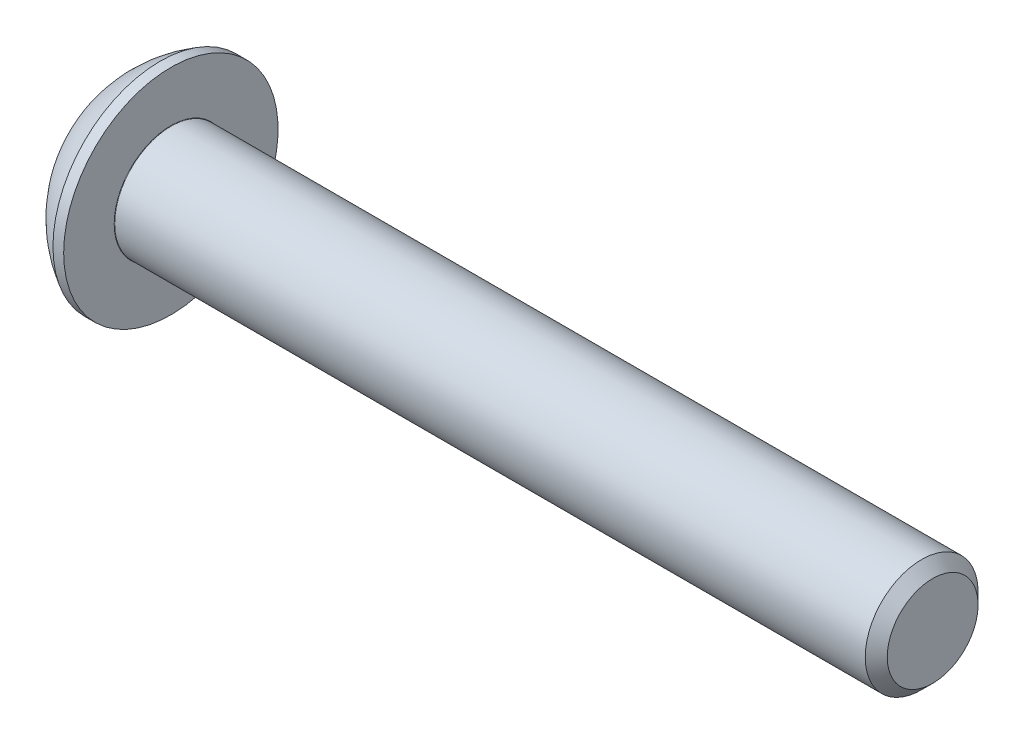
ISO-10303-21;
HEADER;
FILE_DESCRIPTION(('STEP AP214'),'2;1');
FILE_NAME('part.step','',(''),(''),'','','');
FILE_SCHEMA(('AUTOMOTIVE_DESIGN { 1 0 10303 214 1 1 1 1 }'));
ENDSEC;
DATA;
#1=APPLICATION_CONTEXT('core data for automotive mechanical design processes');
#2=APPLICATION_PROTOCOL_DEFINITION('international standard','automotive_design',2000,#1);
#3=PRODUCT_CONTEXT('',#1,'mechanical');
#4=PRODUCT('Part','Part','',(#3));
#5=PRODUCT_RELATED_PRODUCT_CATEGORY('part','',(#4));
#6=PRODUCT_DEFINITION_FORMATION('','',#4);
#7=PRODUCT_DEFINITION_CONTEXT('part definition',#1,'design');
#8=PRODUCT_DEFINITION('design','',#6,#7);
#9=PRODUCT_DEFINITION_SHAPE('','',#8);
#10=(LENGTH_UNIT() NAMED_UNIT(*) SI_UNIT(.MILLI.,.METRE.));
#11=(NAMED_UNIT(*) PLANE_ANGLE_UNIT() SI_UNIT($,.RADIAN.));
#12=(NAMED_UNIT(*) SI_UNIT($,.STERADIAN.) SOLID_ANGLE_UNIT());
#13=UNCERTAINTY_MEASURE_WITH_UNIT(LENGTH_MEASURE(1.E-05),#10,'distance_accuracy_value','');
#14=(GEOMETRIC_REPRESENTATION_CONTEXT(3) GLOBAL_UNCERTAINTY_ASSIGNED_CONTEXT((#13)) GLOBAL_UNIT_ASSIGNED_CONTEXT((#10,
#11,#12)) REPRESENTATION_CONTEXT('',''));
#15=CARTESIAN_POINT('',(0.,0.,0.));
#16=DIRECTION('',(0.,0.,1.));
#17=DIRECTION('',(1.,0.,0.));
#18=AXIS2_PLACEMENT_3D('',#15,#16,#17);
#19=CARTESIAN_POINT('',(0.,0.,0.));
#20=DIRECTION('',(-1.,0.,0.));
#21=DIRECTION('',(0.,0.,1.));
#22=AXIS2_PLACEMENT_3D('',#19,#20,#21);
#23=PLANE('',#22);
#24=CARTESIAN_POINT('',(0.,0.,0.));
#25=DIRECTION('',(-1.,0.,0.));
#26=DIRECTION('',(0.,0.,1.));
#27=AXIS2_PLACEMENT_3D('',#24,#25,#26);
#28=CIRCLE('',#27,1.9);
#29=CARTESIAN_POINT('',(0.,1.9,0.));
#30=VERTEX_POINT('',#29);
#31=EDGE_CURVE('E158',#30,#30,#28,.T.);
#32=ORIENTED_EDGE('',*,*,#31,.T.);
#33=EDGE_LOOP('',(#32));
#34=FACE_BOUND('',#33,.T.);
#35=DIRECTION('',(0.,-1.,0.));
#36=VECTOR('',#35,1.);
#37=CARTESIAN_POINT('',(0.,-0.721687836487031,1.25));
#38=LINE('',#37,#36);
#39=CARTESIAN_POINT('',(0.,0.721687836487033,1.25));
#40=VERTEX_POINT('',#39);
#41=CARTESIAN_POINT('',(0.,-0.721687836487031,1.25));
#42=VERTEX_POINT('',#41);
#43=EDGE_CURVE('E53',#40,#42,#38,.T.);
#44=ORIENTED_EDGE('',*,*,#43,.T.);
#45=DIRECTION('',(0.,-0.5,-0.866025403784438));
#46=VECTOR('',#45,1.);
#47=CARTESIAN_POINT('',(0.,-1.44337567297406,0.));
#48=LINE('',#47,#46);
#49=CARTESIAN_POINT('',(0.,-1.44337567297406,0.));
#50=VERTEX_POINT('',#49);
#51=EDGE_CURVE('E278',#42,#50,#48,.T.);
#52=ORIENTED_EDGE('',*,*,#51,.T.);
#53=DIRECTION('',(0.,0.5,-0.866025403784439));
#54=VECTOR('',#53,1.);
#55=CARTESIAN_POINT('',(0.,-0.721687836487031,-1.25));
#56=LINE('',#55,#54);
#57=CARTESIAN_POINT('',(0.,-0.721687836487031,-1.25));
#58=VERTEX_POINT('',#57);
#59=EDGE_CURVE('E133',#50,#58,#56,.T.);
#60=ORIENTED_EDGE('',*,*,#59,.T.);
#61=DIRECTION('',(0.,1.,0.));
#62=VECTOR('',#61,1.);
#63=CARTESIAN_POINT('',(0.,0.721687836487033,-1.25));
#64=LINE('',#63,#62);
#65=CARTESIAN_POINT('',(0.,0.721687836487033,-1.25));
#66=VERTEX_POINT('',#65);
#67=EDGE_CURVE('E281',#58,#66,#64,.T.);
#68=ORIENTED_EDGE('',*,*,#67,.T.);
#69=DIRECTION('',(0.,0.5,0.866025403784439));
#70=VECTOR('',#69,1.);
#71=CARTESIAN_POINT('',(0.,1.44337567297406,0.));
#72=LINE('',#71,#70);
#73=CARTESIAN_POINT('',(0.,1.44337567297406,0.));
#74=VERTEX_POINT('',#73);
#75=EDGE_CURVE('E283',#66,#74,#72,.T.);
#76=ORIENTED_EDGE('',*,*,#75,.T.);
#77=DIRECTION('',(0.,-0.5,0.866025403784439));
#78=VECTOR('',#77,1.);
#79=CARTESIAN_POINT('',(0.,0.721687836487033,1.25));
#80=LINE('',#79,#78);
#81=EDGE_CURVE('E285',#74,#40,#80,.T.);
#82=ORIENTED_EDGE('',*,*,#81,.T.);
#83=EDGE_LOOP('',(#44,#52,#60,#68,#76,#82));
#84=FACE_BOUND('',#83,.T.);
#85=ADVANCED_FACE('F38',(#34,#84),#23,.T.);
#86=CARTESIAN_POINT('',(3.88527472527473,0.,0.));
#87=DIRECTION('',(-1.,0.,0.));
#88=DIRECTION('',(0.,1.,0.));
#89=AXIS2_PLACEMENT_3D('',#86,#87,#88);
#90=SPHERICAL_SURFACE('',#89,4.32496932831421);
#91=CARTESIAN_POINT('',(1.82,0.,0.));
#92=DIRECTION('',(-1.,0.,0.));
#93=DIRECTION('',(0.,0.,1.));
#94=AXIS2_PLACEMENT_3D('',#91,#92,#93);
#95=CIRCLE('',#94,3.8);
#96=CARTESIAN_POINT('',(1.82,3.8,0.));
#97=VERTEX_POINT('',#96);
#98=EDGE_CURVE('E155',#97,#97,#95,.T.);
#99=CARTESIAN_POINT('',(1.82,3.8,0.));
#100=CARTESIAN_POINT('',(1.79553223778235,3.78670197498787,0.));
#101=CARTESIAN_POINT('',(1.77119294730718,3.77316757105695,0.));
#102=CARTESIAN_POINT('',(1.72278031308152,3.74563119292022,0.));
#103=CARTESIAN_POINT('',(1.69870696933103,3.73162921871441,0.));
#104=CARTESIAN_POINT('',(1.65083523179446,3.7031628875906,0.));
#105=CARTESIAN_POINT('',(1.62703683800837,3.6886985306726,0.));
#106=CARTESIAN_POINT('',(1.57972387446203,3.65931284095831,0.));
#107=CARTESIAN_POINT('',(1.55620930470177,3.64439150816201,0.));
#108=CARTESIAN_POINT('',(1.50947276449225,3.61409743150663,0.));
#109=CARTESIAN_POINT('',(1.48625079404298,3.59872468764754,0.));
#110=CARTESIAN_POINT('',(1.44010811665664,3.56753352546924,0.));
#111=CARTESIAN_POINT('',(1.41718740971957,3.55171510715004,0.));
#112=CARTESIAN_POINT('',(1.37165581166264,3.51963849804541,0.));
#113=CARTESIAN_POINT('',(1.34904492054277,3.50338030725998,0.));
#114=CARTESIAN_POINT('',(1.30414139068938,3.47043021954608,0.));
#115=CARTESIAN_POINT('',(1.28184875195586,3.45373832261761,0.));
#116=CARTESIAN_POINT('',(1.23759004473439,3.41992705070111,0.));
#117=CARTESIAN_POINT('',(1.21562397624644,3.40280767571308,0.));
#118=CARTESIAN_POINT('',(1.17202660551528,3.3681478352793,0.));
#119=CARTESIAN_POINT('',(1.15039530327208,3.35060736983354,0.));
#120=CARTESIAN_POINT('',(1.10747553612391,3.31511189319918,0.));
#121=CARTESIAN_POINT('',(1.08618707121895,3.29715688201057,0.));
#122=CARTESIAN_POINT('',(1.04396092192025,3.26083901328234,0.));
#123=CARTESIAN_POINT('',(1.02302323752652,3.24247615574272,0.));
#124=CARTESIAN_POINT('',(0.981506461539866,3.20534944588,0.));
#125=CARTESIAN_POINT('',(0.960927369946953,3.18658559355691,0.));
#126=CARTESIAN_POINT('',(0.920135458053,3.14866389531445,0.));
#127=CARTESIAN_POINT('',(0.899922637751959,3.12950604939509,0.));
#128=CARTESIAN_POINT('',(0.859870810269304,3.09080351215454,0.));
#129=CARTESIAN_POINT('',(0.84003180308769,3.07125882083336,0.));
#130=CARTESIAN_POINT('',(0.800735004193914,3.0317898853238,0.));
#131=CARTESIAN_POINT('',(0.781277212481753,3.01186564113541,0.));
#132=CARTESIAN_POINT('',(0.74275010463742,2.97164503404517,0.));
#133=CARTESIAN_POINT('',(0.723680788505248,2.95134867114332,0.));
#134=CARTESIAN_POINT('',(0.685937746983035,2.91039139962521,0.));
#135=CARTESIAN_POINT('',(0.667264021592993,2.88973049100894,0.));
#136=CARTESIAN_POINT('',(0.630319129113973,2.84805183708071,0.));
#137=CARTESIAN_POINT('',(0.612047962024995,2.82703409176873,0.));
#138=CARTESIAN_POINT('',(0.575915003504076,2.78464960661105,0.));
#139=CARTESIAN_POINT('',(0.558053212072136,2.76328286676534,0.));
#140=CARTESIAN_POINT('',(0.522745669474639,2.72020836491933,0.));
#141=CARTESIAN_POINT('',(0.505299918309083,2.69850060291903,0.));
#142=CARTESIAN_POINT('',(0.470830965620255,2.65475215638556,0.));
#143=CARTESIAN_POINT('',(0.453807764096983,2.63271147185239,0.));
#144=CARTESIAN_POINT('',(0.420190262406822,2.58830540409509,0.));
#145=CARTESIAN_POINT('',(0.403595962239933,2.56594002087097,0.));
#146=CARTESIAN_POINT('',(0.370842454943267,2.52089290072626,0.));
#147=CARTESIAN_POINT('',(0.354683247813489,2.49821116380567,0.));
#148=CARTESIAN_POINT('',(0.322805955934172,2.45253979929826,0.));
#149=CARTESIAN_POINT('',(0.307087871184632,2.42955017171145,0.));
#150=CARTESIAN_POINT('',(0.276098688799191,2.38327160379141,0.));
#151=CARTESIAN_POINT('',(0.26082759116329,2.35998266345818,0.));
#152=CARTESIAN_POINT('',(0.230738081024336,2.31311415961106,0.));
#153=CARTESIAN_POINT('',(0.215919668521284,2.28953459609717,0.));
#154=CARTESIAN_POINT('',(0.186741057514276,2.24209364401868,0.));
#155=CARTESIAN_POINT('',(0.172380859010322,2.21823225545407,0.));
#156=CARTESIAN_POINT('',(0.144124034818959,2.17023655608655,0.));
#157=CARTESIAN_POINT('',(0.13022740913155,2.14610224528364,0.));
#158=CARTESIAN_POINT('',(0.102902912986767,2.09756970784785,0.));
#159=CARTESIAN_POINT('',(0.0894750425293926,2.07317148121498,0.));
#160=CARTESIAN_POINT('',(0.0630930771761374,2.02412021042083,0.));
#161=CARTESIAN_POINT('',(0.0501389822802571,1.99946716625955,0.));
#162=CARTESIAN_POINT('',(0.0247093637594993,1.94991547834234,0.));
#163=CARTESIAN_POINT('',(0.012233840134622,1.9250168345864,0.));
#164=CARTESIAN_POINT('',(0.,1.9,0.));
#165=B_SPLINE_CURVE_WITH_KNOTS('',3,(#99,#100,#101,#102,#103,#104,#105,#106,#107,#108,#109,#110,
#111,#112,#113,#114,#115,#116,#117,#118,#119,#120,#121,#122,#123,#124,#125,#126,#127,#128,#129,
#130,#131,#132,#133,#134,#135,#136,#137,#138,#139,#140,#141,#142,#143,#144,#145,#146,#147,#148,
#149,#150,#151,#152,#153,#154,#155,#156,#157,#158,#159,#160,#161,#162,#163,#164),.UNSPECIFIED.,
.F.,.F.,(4,2,2,2,2,2,2,2,2,2,2,2,2,2,2,2,2,2,2,2,2,2,2,2,2,2,2,2,2,2,2,2,4),(0.,
0.083542578086179,0.167085156172358,0.250627734258537,0.334170312344716,0.417712890430896,
0.501255468517075,0.584798046603255,0.668340624689433,0.751883202775613,0.835425780861792,
0.91896835894797,1.00251093703415,1.08605351512033,1.16959609320651,1.25313867129269,
1.33668124937887,1.42022382746505,1.50376640555123,1.5873089836374,1.67085156172358,
1.75439413980976,1.83793671789594,1.92147929598212,2.0050218740683,2.08856445215448,
2.17210703024066,2.25564960832684,2.33919218641302,2.4227347644992,2.50627734258538,
2.58981992067155,2.67336249875773),.UNSPECIFIED.);
#166=EDGE_CURVE('BSEAM179',#97,#30,#165,.T.);
#167=ORIENTED_EDGE('',*,*,#98,.T.);
#168=ORIENTED_EDGE('',*,*,#31,.F.);
#169=ORIENTED_EDGE('',*,*,#166,.T.);
#170=ORIENTED_EDGE('',*,*,#166,.F.);
#171=EDGE_LOOP('',(#167,#169,#168,#170));
#172=FACE_BOUND('',#171,.T.);
#173=ADVANCED_FACE('F179',(#172),#90,.T.);
#174=CARTESIAN_POINT('',(0.,0.,0.));
#175=DIRECTION('',(-1.,0.,0.));
#176=DIRECTION('',(0.,0.,1.));
#177=AXIS2_PLACEMENT_3D('',#174,#175,#176);
#178=CYLINDRICAL_SURFACE('',#177,3.8);
#179=ORIENTED_EDGE('',*,*,#98,.F.);
#180=EDGE_LOOP('',(#179));
#181=FACE_BOUND('',#180,.T.);
#182=CARTESIAN_POINT('',(2.2,0.,0.));
#183=DIRECTION('',(-1.,0.,0.));
#184=DIRECTION('',(0.,0.,1.));
#185=AXIS2_PLACEMENT_3D('',#182,#183,#184);
#186=CIRCLE('',#185,3.8);
#187=CARTESIAN_POINT('',(2.2,0.,3.8));
#188=VERTEX_POINT('',#187);
#189=EDGE_CURVE('E152',#188,#188,#186,.T.);
#190=ORIENTED_EDGE('',*,*,#189,.T.);
#191=EDGE_LOOP('',(#190));
#192=FACE_BOUND('',#191,.T.);
#193=ADVANCED_FACE('F184',(#181,#192),#178,.T.);
#194=CARTESIAN_POINT('',(2.2,2.,0.));
#195=DIRECTION('',(-1.,0.,0.));
#196=DIRECTION('',(0.,0.,1.));
#197=AXIS2_PLACEMENT_3D('',#194,#195,#196);
#198=PLANE('',#197);
#199=CARTESIAN_POINT('',(2.2,0.,0.));
#200=DIRECTION('',(-1.,0.,0.));
#201=DIRECTION('',(0.,0.,1.));
#202=AXIS2_PLACEMENT_3D('',#199,#200,#201);
#203=CIRCLE('',#202,2.01);
#204=CARTESIAN_POINT('',(2.2,0.,2.01));
#205=VERTEX_POINT('',#204);
#206=EDGE_CURVE('E46',#205,#205,#203,.T.);
#207=ORIENTED_EDGE('',*,*,#206,.T.);
#208=EDGE_LOOP('',(#207));
#209=FACE_BOUND('',#208,.T.);
#210=ORIENTED_EDGE('',*,*,#189,.F.);
#211=EDGE_LOOP('',(#210));
#212=FACE_BOUND('',#211,.T.);
#213=ADVANCED_FACE('F163',(#209,#212),#198,.F.);
#214=CARTESIAN_POINT('',(0.,0.,0.));
#215=DIRECTION('',(-1.,0.,0.));
#216=DIRECTION('',(0.,0.,1.));
#217=AXIS2_PLACEMENT_3D('',#214,#215,#216);
#218=CYLINDRICAL_SURFACE('',#217,2.);
#219=CARTESIAN_POINT('',(2.21,0.,0.));
#220=DIRECTION('',(-1.,0.,0.));
#221=DIRECTION('',(0.,0.,1.));
#222=AXIS2_PLACEMENT_3D('',#219,#220,#221);
#223=CIRCLE('',#222,2.);
#224=CARTESIAN_POINT('',(2.21,0.,2.));
#225=VERTEX_POINT('',#224);
#226=EDGE_CURVE('E11',#225,#225,#223,.F.);
#227=ORIENTED_EDGE('',*,*,#226,.T.);
#228=EDGE_LOOP('',(#227));
#229=FACE_BOUND('',#228,.T.);
#230=CARTESIAN_POINT('',(28.81,0.,0.));
#231=DIRECTION('',(-1.,0.,0.));
#232=DIRECTION('',(0.,0.,1.));
#233=AXIS2_PLACEMENT_3D('',#230,#231,#232);
#234=CIRCLE('',#233,2.);
#235=CARTESIAN_POINT('',(28.81,0.,2.));
#236=VERTEX_POINT('',#235);
#237=EDGE_CURVE('E149',#236,#236,#234,.T.);
#238=ORIENTED_EDGE('',*,*,#237,.T.);
#239=EDGE_LOOP('',(#238));
#240=FACE_BOUND('',#239,.T.);
#241=ADVANCED_FACE('F193',(#229,#240),#218,.T.);
#242=CARTESIAN_POINT('',(29.2,0.,0.));
#243=DIRECTION('',(-1.,0.,0.));
#244=DIRECTION('',(0.,0.,1.));
#245=AXIS2_PLACEMENT_3D('',#242,#243,#244);
#246=CONICAL_SURFACE('',#245,1.61,0.785398163397443);
#247=ORIENTED_EDGE('',*,*,#237,.F.);
#248=EDGE_LOOP('',(#247));
#249=FACE_BOUND('',#248,.T.);
#250=CARTESIAN_POINT('',(29.2,0.,0.));
#251=DIRECTION('',(-1.,0.,0.));
#252=DIRECTION('',(0.,0.,1.));
#253=AXIS2_PLACEMENT_3D('',#250,#251,#252);
#254=CIRCLE('',#253,1.61);
#255=CARTESIAN_POINT('',(29.2,0.,1.61));
#256=VERTEX_POINT('',#255);
#257=EDGE_CURVE('E145',#256,#256,#254,.T.);
#258=ORIENTED_EDGE('',*,*,#257,.T.);
#259=EDGE_LOOP('',(#258));
#260=FACE_BOUND('',#259,.T.);
#261=ADVANCED_FACE('F174',(#249,#260),#246,.T.);
#262=CARTESIAN_POINT('',(29.2,0.,0.));
#263=DIRECTION('',(-1.,0.,0.));
#264=DIRECTION('',(0.,0.,1.));
#265=AXIS2_PLACEMENT_3D('',#262,#263,#264);
#266=PLANE('',#265);
#267=ORIENTED_EDGE('',*,*,#257,.F.);
#268=EDGE_LOOP('',(#267));
#269=FACE_BOUND('',#268,.T.);
#270=ADVANCED_FACE('F167',(#269),#266,.F.);
#271=CARTESIAN_POINT('',(2.21,0.,0.));
#272=DIRECTION('',(-1.,0.,0.));
#273=DIRECTION('',(0.,0.,1.));
#274=AXIS2_PLACEMENT_3D('',#271,#272,#273);
#275=TOROIDAL_SURFACE('',#274,2.01,0.01);
#276=ORIENTED_EDGE('',*,*,#226,.F.);
#277=EDGE_LOOP('',(#276));
#278=FACE_BOUND('',#277,.T.);
#279=ORIENTED_EDGE('',*,*,#206,.F.);
#280=EDGE_LOOP('',(#279));
#281=FACE_BOUND('',#280,.T.);
#282=ADVANCED_FACE('F40',(#278,#281),#275,.F.);
#283=CARTESIAN_POINT('',(1.3,-1.44337567297406,0.));
#284=DIRECTION('',(0.,0.866025403784438,-0.5));
#285=DIRECTION('',(0.,0.5,0.866025403784439));
#286=AXIS2_PLACEMENT_3D('',#283,#284,#285);
#287=PLANE('',#286);
#288=DIRECTION('',(0.,-0.5,-0.866025403784438));
#289=VECTOR('',#288,1.);
#290=CARTESIAN_POINT('',(1.3,-1.44337567297406,0.));
#291=LINE('',#290,#289);
#292=CARTESIAN_POINT('',(1.3,-0.721687836487031,1.25));
#293=VERTEX_POINT('',#292);
#294=CARTESIAN_POINT('',(1.3,-1.08253175473055,0.625));
#295=VERTEX_POINT('',#294);
#296=EDGE_CURVE('E119',#293,#295,#291,.T.);
#297=ORIENTED_EDGE('',*,*,#296,.T.);
#298=CARTESIAN_POINT('',(1.3,-1.44337567297406,0.));
#299=VERTEX_POINT('',#298);
#300=EDGE_CURVE('E114',#295,#299,#291,.T.);
#301=ORIENTED_EDGE('',*,*,#300,.T.);
#302=DIRECTION('',(-1.,0.,0.));
#303=VECTOR('',#302,1.);
#304=CARTESIAN_POINT('',(1.3,-1.44337567297406,0.));
#305=LINE('',#304,#303);
#306=EDGE_CURVE('E116',#299,#50,#305,.T.);
#307=ORIENTED_EDGE('',*,*,#306,.T.);
#308=ORIENTED_EDGE('',*,*,#51,.F.);
#309=DIRECTION('',(-1.,0.,0.));
#310=VECTOR('',#309,1.);
#311=CARTESIAN_POINT('',(1.3,-0.721687836487031,1.25));
#312=LINE('',#311,#310);
#313=EDGE_CURVE('E274',#293,#42,#312,.T.);
#314=ORIENTED_EDGE('',*,*,#313,.F.);
#315=EDGE_LOOP('',(#297,#301,#307,#308,#314));
#316=FACE_BOUND('',#315,.T.);
#317=ADVANCED_FACE('F115',(#316),#287,.T.);
#318=CARTESIAN_POINT('',(1.3,-0.721687836487031,-1.25));
#319=DIRECTION('',(0.,0.866025403784439,0.5));
#320=DIRECTION('',(0.,-0.5,0.866025403784439));
#321=AXIS2_PLACEMENT_3D('',#318,#319,#320);
#322=PLANE('',#321);
#323=DIRECTION('',(0.,0.5,-0.866025403784439));
#324=VECTOR('',#323,1.);
#325=CARTESIAN_POINT('',(1.3,-0.721687836487031,-1.25));
#326=LINE('',#325,#324);
#327=CARTESIAN_POINT('',(1.3,-1.08253175473055,-0.625));
#328=VERTEX_POINT('',#327);
#329=EDGE_CURVE('E61',#299,#328,#326,.T.);
#330=ORIENTED_EDGE('',*,*,#329,.T.);
#331=CARTESIAN_POINT('',(1.3,-0.721687836487031,-1.25));
#332=VERTEX_POINT('',#331);
#333=EDGE_CURVE('E128',#328,#332,#326,.T.);
#334=ORIENTED_EDGE('',*,*,#333,.T.);
#335=DIRECTION('',(-1.,0.,0.));
#336=VECTOR('',#335,1.);
#337=CARTESIAN_POINT('',(1.3,-0.721687836487031,-1.25));
#338=LINE('',#337,#336);
#339=EDGE_CURVE('E135',#332,#58,#338,.T.);
#340=ORIENTED_EDGE('',*,*,#339,.T.);
#341=ORIENTED_EDGE('',*,*,#59,.F.);
#342=ORIENTED_EDGE('',*,*,#306,.F.);
#343=EDGE_LOOP('',(#330,#334,#340,#341,#342));
#344=FACE_BOUND('',#343,.T.);
#345=ADVANCED_FACE('F131',(#344),#322,.T.);
#346=CARTESIAN_POINT('',(1.3,0.721687836487033,-1.25));
#347=DIRECTION('',(0.,0.,1.));
#348=DIRECTION('',(0.,-1.,0.));
#349=AXIS2_PLACEMENT_3D('',#346,#347,#348);
#350=PLANE('',#349);
#351=DIRECTION('',(0.,1.,0.));
#352=VECTOR('',#351,1.);
#353=CARTESIAN_POINT('',(1.3,0.721687836487033,-1.25));
#354=LINE('',#353,#352);
#355=CARTESIAN_POINT('',(1.3,0.,-1.25));
#356=VERTEX_POINT('',#355);
#357=EDGE_CURVE('E255',#332,#356,#354,.T.);
#358=ORIENTED_EDGE('',*,*,#357,.T.);
#359=CARTESIAN_POINT('',(1.3,0.721687836487033,-1.25));
#360=VERTEX_POINT('',#359);
#361=EDGE_CURVE('E127',#356,#360,#354,.T.);
#362=ORIENTED_EDGE('',*,*,#361,.T.);
#363=DIRECTION('',(-1.,0.,0.));
#364=VECTOR('',#363,1.);
#365=CARTESIAN_POINT('',(1.3,0.721687836487033,-1.25));
#366=LINE('',#365,#364);
#367=EDGE_CURVE('E140',#360,#66,#366,.T.);
#368=ORIENTED_EDGE('',*,*,#367,.T.);
#369=ORIENTED_EDGE('',*,*,#67,.F.);
#370=ORIENTED_EDGE('',*,*,#339,.F.);
#371=EDGE_LOOP('',(#358,#362,#368,#369,#370));
#372=FACE_BOUND('',#371,.T.);
#373=ADVANCED_FACE('F207',(#372),#350,.T.);
#374=CARTESIAN_POINT('',(1.3,1.44337567297406,0.));
#375=DIRECTION('',(0.,-0.866025403784439,0.5));
#376=DIRECTION('',(0.,-0.5,-0.866025403784439));
#377=AXIS2_PLACEMENT_3D('',#374,#375,#376);
#378=PLANE('',#377);
#379=DIRECTION('',(0.,0.5,0.866025403784439));
#380=VECTOR('',#379,1.);
#381=CARTESIAN_POINT('',(1.3,1.44337567297406,0.));
#382=LINE('',#381,#380);
#383=CARTESIAN_POINT('',(1.3,1.08253175473055,-0.625));
#384=VERTEX_POINT('',#383);
#385=EDGE_CURVE('E244',#360,#384,#382,.T.);
#386=ORIENTED_EDGE('',*,*,#385,.T.);
#387=CARTESIAN_POINT('',(1.3,1.44337567297406,0.));
#388=VERTEX_POINT('',#387);
#389=EDGE_CURVE('E249',#384,#388,#382,.T.);
#390=ORIENTED_EDGE('',*,*,#389,.T.);
#391=DIRECTION('',(-1.,0.,0.));
#392=VECTOR('',#391,1.);
#393=CARTESIAN_POINT('',(1.3,1.44337567297406,0.));
#394=LINE('',#393,#392);
#395=EDGE_CURVE('E289',#388,#74,#394,.T.);
#396=ORIENTED_EDGE('',*,*,#395,.T.);
#397=ORIENTED_EDGE('',*,*,#75,.F.);
#398=ORIENTED_EDGE('',*,*,#367,.F.);
#399=EDGE_LOOP('',(#386,#390,#396,#397,#398));
#400=FACE_BOUND('',#399,.T.);
#401=ADVANCED_FACE('F210',(#400),#378,.T.);
#402=CARTESIAN_POINT('',(1.3,0.721687836487033,1.25));
#403=DIRECTION('',(0.,-0.866025403784439,-0.5));
#404=DIRECTION('',(0.,0.5,-0.866025403784439));
#405=AXIS2_PLACEMENT_3D('',#402,#403,#404);
#406=PLANE('',#405);
#407=DIRECTION('',(0.,-0.5,0.866025403784439));
#408=VECTOR('',#407,1.);
#409=CARTESIAN_POINT('',(1.3,0.721687836487033,1.25));
#410=LINE('',#409,#408);
#411=CARTESIAN_POINT('',(1.3,1.08253175473055,0.625));
#412=VERTEX_POINT('',#411);
#413=EDGE_CURVE('E252',#388,#412,#410,.T.);
#414=ORIENTED_EDGE('',*,*,#413,.T.);
#415=CARTESIAN_POINT('',(1.3,0.721687836487033,1.25));
#416=VERTEX_POINT('',#415);
#417=EDGE_CURVE('E260',#412,#416,#410,.T.);
#418=ORIENTED_EDGE('',*,*,#417,.T.);
#419=DIRECTION('',(-1.,0.,0.));
#420=VECTOR('',#419,1.);
#421=CARTESIAN_POINT('',(1.3,0.721687836487033,1.25));
#422=LINE('',#421,#420);
#423=EDGE_CURVE('E273',#416,#40,#422,.T.);
#424=ORIENTED_EDGE('',*,*,#423,.T.);
#425=ORIENTED_EDGE('',*,*,#81,.F.);
#426=ORIENTED_EDGE('',*,*,#395,.F.);
#427=EDGE_LOOP('',(#414,#418,#424,#425,#426));
#428=FACE_BOUND('',#427,.T.);
#429=ADVANCED_FACE('F214',(#428),#406,.T.);
#430=CARTESIAN_POINT('',(1.3,-0.721687836487031,1.25));
#431=DIRECTION('',(0.,0.,-1.));
#432=DIRECTION('',(0.,1.,0.));
#433=AXIS2_PLACEMENT_3D('',#430,#431,#432);
#434=PLANE('',#433);
#435=DIRECTION('',(0.,-1.,0.));
#436=VECTOR('',#435,1.);
#437=CARTESIAN_POINT('',(1.3,-0.721687836487031,1.25));
#438=LINE('',#437,#436);
#439=CARTESIAN_POINT('',(1.3,0.,1.25));
#440=VERTEX_POINT('',#439);
#441=EDGE_CURVE('E266',#416,#440,#438,.T.);
#442=ORIENTED_EDGE('',*,*,#441,.T.);
#443=EDGE_CURVE('E268',#440,#293,#438,.T.);
#444=ORIENTED_EDGE('',*,*,#443,.T.);
#445=ORIENTED_EDGE('',*,*,#313,.T.);
#446=ORIENTED_EDGE('',*,*,#43,.F.);
#447=ORIENTED_EDGE('',*,*,#423,.F.);
#448=EDGE_LOOP('',(#442,#444,#445,#446,#447));
#449=FACE_BOUND('',#448,.T.);
#450=ADVANCED_FACE('F218',(#449),#434,.T.);
#451=CARTESIAN_POINT('',(1.3,-1.44337567297406,0.));
#452=DIRECTION('',(1.,0.,0.));
#453=DIRECTION('',(0.,0.,-1.));
#454=AXIS2_PLACEMENT_3D('',#451,#452,#453);
#455=PLANE('',#454);
#456=CARTESIAN_POINT('',(1.3,0.,0.));
#457=DIRECTION('',(-1.,0.,0.));
#458=DIRECTION('',(0.,0.,1.));
#459=AXIS2_PLACEMENT_3D('',#456,#457,#458);
#460=CIRCLE('',#459,1.25);
#461=EDGE_CURVE('E241',#384,#356,#460,.T.);
#462=ORIENTED_EDGE('',*,*,#461,.F.);
#463=ORIENTED_EDGE('',*,*,#385,.F.);
#464=ORIENTED_EDGE('',*,*,#361,.F.);
#465=EDGE_LOOP('',(#462,#463,#464));
#466=FACE_BOUND('',#465,.T.);
#467=ADVANCED_FACE('F222',(#466),#455,.F.);
#468=EDGE_CURVE('E146',#412,#384,#460,.T.);
#469=ORIENTED_EDGE('',*,*,#468,.F.);
#470=ORIENTED_EDGE('',*,*,#413,.F.);
#471=ORIENTED_EDGE('',*,*,#389,.F.);
#472=EDGE_LOOP('',(#469,#470,#471));
#473=FACE_BOUND('',#472,.T.);
#474=ADVANCED_FACE('F231',(#473),#455,.F.);
#475=EDGE_CURVE('E139',#440,#412,#460,.T.);
#476=ORIENTED_EDGE('',*,*,#475,.F.);
#477=ORIENTED_EDGE('',*,*,#441,.F.);
#478=ORIENTED_EDGE('',*,*,#417,.F.);
#479=EDGE_LOOP('',(#476,#477,#478));
#480=FACE_BOUND('',#479,.T.);
#481=ADVANCED_FACE('F236',(#480),#455,.F.);
#482=EDGE_CURVE('E134',#295,#440,#460,.T.);
#483=ORIENTED_EDGE('',*,*,#482,.F.);
#484=ORIENTED_EDGE('',*,*,#296,.F.);
#485=ORIENTED_EDGE('',*,*,#443,.F.);
#486=EDGE_LOOP('',(#483,#484,#485));
#487=FACE_BOUND('',#486,.T.);
#488=ADVANCED_FACE('F229',(#487),#455,.F.);
#489=EDGE_CURVE('E125',#328,#295,#460,.T.);
#490=ORIENTED_EDGE('',*,*,#489,.F.);
#491=ORIENTED_EDGE('',*,*,#329,.F.);
#492=ORIENTED_EDGE('',*,*,#300,.F.);
#493=EDGE_LOOP('',(#490,#491,#492));
#494=FACE_BOUND('',#493,.T.);
#495=ADVANCED_FACE('F124',(#494),#455,.F.);
#496=EDGE_CURVE('E247',#356,#328,#460,.T.);
#497=ORIENTED_EDGE('',*,*,#496,.F.);
#498=ORIENTED_EDGE('',*,*,#357,.F.);
#499=ORIENTED_EDGE('',*,*,#333,.F.);
#500=EDGE_LOOP('',(#497,#498,#499));
#501=FACE_BOUND('',#500,.T.);
#502=ADVANCED_FACE('F202',(#501),#455,.F.);
#503=CARTESIAN_POINT('',(2.02168783648704,0.,0.));
#504=DIRECTION('',(-1.,0.,0.));
#505=DIRECTION('',(0.,0.,1.));
#506=AXIS2_PLACEMENT_3D('',#503,#504,#505);
#507=CONICAL_SURFACE('',#506,0.,1.04719755119659);
#508=ORIENTED_EDGE('',*,*,#475,.T.);
#509=ORIENTED_EDGE('',*,*,#468,.T.);
#510=ORIENTED_EDGE('',*,*,#461,.T.);
#511=ORIENTED_EDGE('',*,*,#496,.T.);
#512=ORIENTED_EDGE('',*,*,#489,.T.);
#513=ORIENTED_EDGE('',*,*,#482,.T.);
#514=EDGE_LOOP('',(#508,#509,#510,#511,#512,#513));
#515=FACE_BOUND('',#514,.T.);
#516=CARTESIAN_POINT('',(2.02168783648704,0.,0.));
#517=VERTEX_POINT('',#516);
#518=VERTEX_LOOP('',#517);
#519=FACE_BOUND('',#518,.T.);
#520=ADVANCED_FACE('F200',(#515,#519),#507,.F.);
#521=CLOSED_SHELL('',(#85,#173,#193,#213,#241,#261,#270,#282,#317,#345,#373,#401,#429,#450,#467,
#474,#481,#488,#495,#502,#520));
#522=MANIFOLD_SOLID_BREP('B2',#521);
#523=ADVANCED_BREP_SHAPE_REPRESENTATION('',(#18,#522),#14);
#524=SHAPE_DEFINITION_REPRESENTATION(#9,#523);
ENDSEC;
END-ISO-10303-21;
